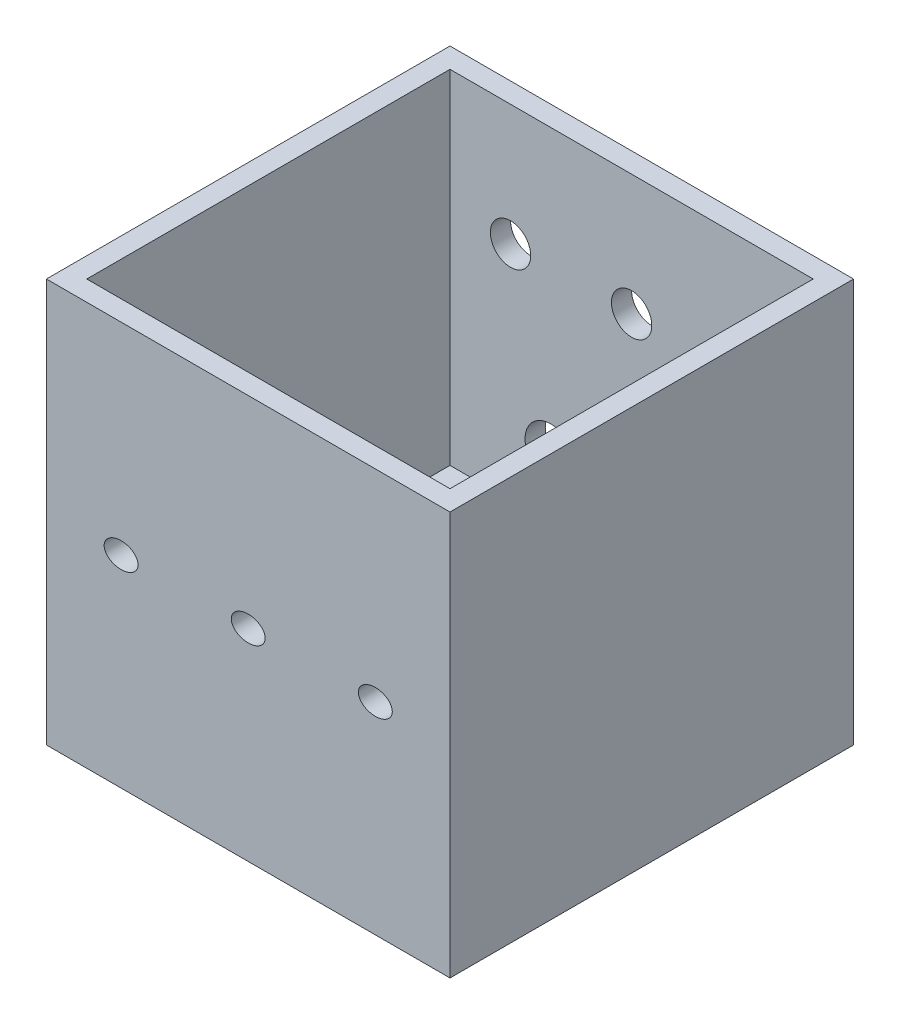
ISO-10303-21;
HEADER;
FILE_DESCRIPTION(('STEP AP214'),'2;1');
FILE_NAME('part.step','',(''),(''),'','','');
FILE_SCHEMA(('AUTOMOTIVE_DESIGN { 1 0 10303 214 1 1 1 1 }'));
ENDSEC;
DATA;
#1=APPLICATION_CONTEXT('core data for automotive mechanical design processes');
#2=APPLICATION_PROTOCOL_DEFINITION('international standard','automotive_design',2000,#1);
#3=PRODUCT_CONTEXT('',#1,'mechanical');
#4=PRODUCT('Part','Part','',(#3));
#5=PRODUCT_RELATED_PRODUCT_CATEGORY('part','',(#4));
#6=PRODUCT_DEFINITION_FORMATION('','',#4);
#7=PRODUCT_DEFINITION_CONTEXT('part definition',#1,'design');
#8=PRODUCT_DEFINITION('design','',#6,#7);
#9=PRODUCT_DEFINITION_SHAPE('','',#8);
#10=(LENGTH_UNIT() NAMED_UNIT(*) SI_UNIT(.MILLI.,.METRE.));
#11=(NAMED_UNIT(*) PLANE_ANGLE_UNIT() SI_UNIT($,.RADIAN.));
#12=(NAMED_UNIT(*) SI_UNIT($,.STERADIAN.) SOLID_ANGLE_UNIT());
#13=UNCERTAINTY_MEASURE_WITH_UNIT(LENGTH_MEASURE(1.E-05),#10,'distance_accuracy_value','');
#14=(GEOMETRIC_REPRESENTATION_CONTEXT(3) GLOBAL_UNCERTAINTY_ASSIGNED_CONTEXT((#13)) GLOBAL_UNIT_ASSIGNED_CONTEXT((#10,
#11,#12)) REPRESENTATION_CONTEXT('',''));
#15=CARTESIAN_POINT('',(0.,0.,0.));
#16=DIRECTION('',(0.,0.,1.));
#17=DIRECTION('',(1.,0.,0.));
#18=AXIS2_PLACEMENT_3D('',#15,#16,#17);
#19=CARTESIAN_POINT('',(31.75,-31.75,63.5));
#20=DIRECTION('',(-1.,0.,0.));
#21=DIRECTION('',(0.,0.,1.));
#22=AXIS2_PLACEMENT_3D('',#19,#20,#21);
#23=PLANE('',#22);
#24=DIRECTION('',(0.,1.,0.));
#25=VECTOR('',#24,1.);
#26=CARTESIAN_POINT('',(31.75,-31.75,0.));
#27=LINE('',#26,#25);
#28=CARTESIAN_POINT('',(31.75,-31.75,0.));
#29=VERTEX_POINT('',#28);
#30=CARTESIAN_POINT('',(31.75,31.75,0.));
#31=VERTEX_POINT('',#30);
#32=EDGE_CURVE('E186',#29,#31,#27,.T.);
#33=ORIENTED_EDGE('',*,*,#32,.T.);
#34=DIRECTION('',(0.,0.,-1.));
#35=VECTOR('',#34,1.);
#36=CARTESIAN_POINT('',(31.75,31.75,63.5));
#37=LINE('',#36,#35);
#38=CARTESIAN_POINT('',(31.75,31.75,63.5));
#39=VERTEX_POINT('',#38);
#40=EDGE_CURVE('E11',#39,#31,#37,.T.);
#41=ORIENTED_EDGE('',*,*,#40,.F.);
#42=DIRECTION('',(0.,1.,0.));
#43=VECTOR('',#42,1.);
#44=CARTESIAN_POINT('',(31.75,-31.75,63.5));
#45=LINE('',#44,#43);
#46=CARTESIAN_POINT('',(31.75,-31.75,63.5));
#47=VERTEX_POINT('',#46);
#48=EDGE_CURVE('E187',#47,#39,#45,.T.);
#49=ORIENTED_EDGE('',*,*,#48,.F.);
#50=DIRECTION('',(0.,0.,-1.));
#51=VECTOR('',#50,1.);
#52=CARTESIAN_POINT('',(31.75,-31.75,63.5));
#53=LINE('',#52,#51);
#54=EDGE_CURVE('E193',#47,#29,#53,.T.);
#55=ORIENTED_EDGE('',*,*,#54,.T.);
#56=EDGE_LOOP('',(#33,#41,#49,#55));
#57=FACE_BOUND('',#56,.T.);
#58=ADVANCED_FACE('F35',(#57),#23,.F.);
#59=CARTESIAN_POINT('',(-31.75,31.75,63.5));
#60=DIRECTION('',(0.,-1.,0.));
#61=DIRECTION('',(0.,0.,-1.));
#62=AXIS2_PLACEMENT_3D('',#59,#60,#61);
#63=PLANE('',#62);
#64=DIRECTION('',(-1.,0.,0.));
#65=VECTOR('',#64,1.);
#66=CARTESIAN_POINT('',(-28.575,31.75,3.175));
#67=LINE('',#66,#65);
#68=CARTESIAN_POINT('',(28.575,31.75,3.175));
#69=VERTEX_POINT('',#68);
#70=CARTESIAN_POINT('',(-28.575,31.75,3.175));
#71=VERTEX_POINT('',#70);
#72=EDGE_CURVE('E140',#69,#71,#67,.T.);
#73=ORIENTED_EDGE('',*,*,#72,.F.);
#74=DIRECTION('',(0.,0.,-1.));
#75=VECTOR('',#74,1.);
#76=CARTESIAN_POINT('',(28.575,31.75,60.325));
#77=LINE('',#76,#75);
#78=CARTESIAN_POINT('',(28.575,31.75,60.325));
#79=VERTEX_POINT('',#78);
#80=EDGE_CURVE('E49',#79,#69,#77,.T.);
#81=ORIENTED_EDGE('',*,*,#80,.F.);
#82=DIRECTION('',(1.,0.,0.));
#83=VECTOR('',#82,1.);
#84=CARTESIAN_POINT('',(-28.575,31.75,60.325));
#85=LINE('',#84,#83);
#86=CARTESIAN_POINT('',(-28.575,31.75,60.325));
#87=VERTEX_POINT('',#86);
#88=EDGE_CURVE('E128',#87,#79,#85,.T.);
#89=ORIENTED_EDGE('',*,*,#88,.F.);
#90=DIRECTION('',(0.,0.,1.));
#91=VECTOR('',#90,1.);
#92=CARTESIAN_POINT('',(-28.575,31.75,60.325));
#93=LINE('',#92,#91);
#94=EDGE_CURVE('E131',#71,#87,#93,.T.);
#95=ORIENTED_EDGE('',*,*,#94,.F.);
#96=EDGE_LOOP('',(#73,#81,#89,#95));
#97=FACE_BOUND('',#96,.T.);
#98=DIRECTION('',(-1.,0.,0.));
#99=VECTOR('',#98,1.);
#100=CARTESIAN_POINT('',(-31.75,31.75,0.));
#101=LINE('',#100,#99);
#102=CARTESIAN_POINT('',(-31.75,31.75,0.));
#103=VERTEX_POINT('',#102);
#104=EDGE_CURVE('E196',#31,#103,#101,.T.);
#105=ORIENTED_EDGE('',*,*,#104,.T.);
#106=DIRECTION('',(0.,0.,-1.));
#107=VECTOR('',#106,1.);
#108=CARTESIAN_POINT('',(-31.75,31.75,63.5));
#109=LINE('',#108,#107);
#110=CARTESIAN_POINT('',(-31.75,31.75,63.5));
#111=VERTEX_POINT('',#110);
#112=EDGE_CURVE('E42',#111,#103,#109,.T.);
#113=ORIENTED_EDGE('',*,*,#112,.F.);
#114=DIRECTION('',(-1.,0.,0.));
#115=VECTOR('',#114,1.);
#116=CARTESIAN_POINT('',(-31.75,31.75,63.5));
#117=LINE('',#116,#115);
#118=EDGE_CURVE('E86',#39,#111,#117,.T.);
#119=ORIENTED_EDGE('',*,*,#118,.F.);
#120=ORIENTED_EDGE('',*,*,#40,.T.);
#121=EDGE_LOOP('',(#105,#113,#119,#120));
#122=FACE_BOUND('',#121,.T.);
#123=ADVANCED_FACE('F224',(#97,#122),#63,.F.);
#124=CARTESIAN_POINT('',(-31.75,-31.75,63.5));
#125=DIRECTION('',(1.,0.,0.));
#126=DIRECTION('',(0.,0.,-1.));
#127=AXIS2_PLACEMENT_3D('',#124,#125,#126);
#128=PLANE('',#127);
#129=DIRECTION('',(0.,-1.,0.));
#130=VECTOR('',#129,1.);
#131=CARTESIAN_POINT('',(-31.75,-31.75,0.));
#132=LINE('',#131,#130);
#133=CARTESIAN_POINT('',(-31.75,-31.75,0.));
#134=VERTEX_POINT('',#133);
#135=EDGE_CURVE('E198',#103,#134,#132,.T.);
#136=ORIENTED_EDGE('',*,*,#135,.T.);
#137=DIRECTION('',(0.,0.,-1.));
#138=VECTOR('',#137,1.);
#139=CARTESIAN_POINT('',(-31.75,-31.75,63.5));
#140=LINE('',#139,#138);
#141=CARTESIAN_POINT('',(-31.75,-31.75,63.5));
#142=VERTEX_POINT('',#141);
#143=EDGE_CURVE('E202',#142,#134,#140,.T.);
#144=ORIENTED_EDGE('',*,*,#143,.F.);
#145=DIRECTION('',(0.,-1.,0.));
#146=VECTOR('',#145,1.);
#147=CARTESIAN_POINT('',(-31.75,-31.75,63.5));
#148=LINE('',#147,#146);
#149=EDGE_CURVE('E190',#111,#142,#148,.T.);
#150=ORIENTED_EDGE('',*,*,#149,.F.);
#151=ORIENTED_EDGE('',*,*,#112,.T.);
#152=EDGE_LOOP('',(#136,#144,#150,#151));
#153=FACE_BOUND('',#152,.T.);
#154=ADVANCED_FACE('F207',(#153),#128,.F.);
#155=CARTESIAN_POINT('',(-31.75,-31.75,63.5));
#156=DIRECTION('',(0.,1.,0.));
#157=DIRECTION('',(0.,0.,1.));
#158=AXIS2_PLACEMENT_3D('',#155,#156,#157);
#159=PLANE('',#158);
#160=DIRECTION('',(1.,0.,0.));
#161=VECTOR('',#160,1.);
#162=CARTESIAN_POINT('',(-31.75,-31.75,0.));
#163=LINE('',#162,#161);
#164=EDGE_CURVE('E79',#134,#29,#163,.T.);
#165=ORIENTED_EDGE('',*,*,#164,.T.);
#166=ORIENTED_EDGE('',*,*,#54,.F.);
#167=DIRECTION('',(1.,0.,0.));
#168=VECTOR('',#167,1.);
#169=CARTESIAN_POINT('',(-31.75,-31.75,63.5));
#170=LINE('',#169,#168);
#171=EDGE_CURVE('E58',#142,#47,#170,.T.);
#172=ORIENTED_EDGE('',*,*,#171,.F.);
#173=ORIENTED_EDGE('',*,*,#143,.T.);
#174=EDGE_LOOP('',(#165,#166,#172,#173));
#175=FACE_BOUND('',#174,.T.);
#176=ADVANCED_FACE('F215',(#175),#159,.F.);
#177=CARTESIAN_POINT('',(0.,0.,63.5));
#178=DIRECTION('',(0.,0.,-1.));
#179=DIRECTION('',(-1.,0.,0.));
#180=AXIS2_PLACEMENT_3D('',#177,#178,#179);
#181=PLANE('',#180);
#182=CARTESIAN_POINT('',(-20.,0.,63.5));
#183=DIRECTION('',(0.,0.,1.));
#184=DIRECTION('',(1.,0.,0.));
#185=AXIS2_PLACEMENT_3D('',#182,#183,#184);
#186=ELLIPSE('',#185,2.667,1.9685);
#187=CARTESIAN_POINT('',(-17.333,0.,63.5));
#188=VERTEX_POINT('',#187);
#189=EDGE_CURVE('E158',#188,#188,#186,.T.);
#190=ORIENTED_EDGE('',*,*,#189,.F.);
#191=EDGE_LOOP('',(#190));
#192=FACE_BOUND('',#191,.T.);
#193=CARTESIAN_POINT('',(20.,0.,63.5));
#194=DIRECTION('',(0.,0.,1.));
#195=DIRECTION('',(1.,0.,0.));
#196=AXIS2_PLACEMENT_3D('',#193,#194,#195);
#197=ELLIPSE('',#196,2.667,1.9685);
#198=CARTESIAN_POINT('',(22.667,0.,63.5));
#199=VERTEX_POINT('',#198);
#200=EDGE_CURVE('E179',#199,#199,#197,.T.);
#201=ORIENTED_EDGE('',*,*,#200,.F.);
#202=EDGE_LOOP('',(#201));
#203=FACE_BOUND('',#202,.T.);
#204=CARTESIAN_POINT('',(0.,0.,63.5));
#205=DIRECTION('',(0.,0.,1.));
#206=DIRECTION('',(1.,0.,0.));
#207=AXIS2_PLACEMENT_3D('',#204,#205,#206);
#208=ELLIPSE('',#207,2.667,1.9685);
#209=CARTESIAN_POINT('',(2.667,0.,63.5));
#210=VERTEX_POINT('',#209);
#211=EDGE_CURVE('E181',#210,#210,#208,.T.);
#212=ORIENTED_EDGE('',*,*,#211,.F.);
#213=EDGE_LOOP('',(#212));
#214=FACE_BOUND('',#213,.T.);
#215=ORIENTED_EDGE('',*,*,#48,.T.);
#216=ORIENTED_EDGE('',*,*,#118,.T.);
#217=ORIENTED_EDGE('',*,*,#149,.T.);
#218=ORIENTED_EDGE('',*,*,#171,.T.);
#219=EDGE_LOOP('',(#215,#216,#217,#218));
#220=FACE_BOUND('',#219,.T.);
#221=ADVANCED_FACE('F217',(#192,#203,#214,#220),#181,.F.);
#222=CARTESIAN_POINT('',(0.,0.,0.));
#223=DIRECTION('',(0.,0.,-1.));
#224=DIRECTION('',(-1.,0.,0.));
#225=AXIS2_PLACEMENT_3D('',#222,#223,#224);
#226=PLANE('',#225);
#227=CARTESIAN_POINT('',(-19.05,12.7,0.));
#228=DIRECTION('',(0.,0.,-1.));
#229=DIRECTION('',(-1.,0.,0.));
#230=AXIS2_PLACEMENT_3D('',#227,#228,#229);
#231=CIRCLE('',#230,3.175);
#232=CARTESIAN_POINT('',(-22.225,12.7,0.));
#233=VERTEX_POINT('',#232);
#234=EDGE_CURVE('E260',#233,#233,#231,.T.);
#235=ORIENTED_EDGE('',*,*,#234,.F.);
#236=EDGE_LOOP('',(#235));
#237=FACE_BOUND('',#236,.T.);
#238=CARTESIAN_POINT('',(0.,12.7,0.));
#239=DIRECTION('',(0.,0.,-1.));
#240=DIRECTION('',(-1.,0.,0.));
#241=AXIS2_PLACEMENT_3D('',#238,#239,#240);
#242=CIRCLE('',#241,3.175);
#243=CARTESIAN_POINT('',(-3.175,12.7,0.));
#244=VERTEX_POINT('',#243);
#245=EDGE_CURVE('E264',#244,#244,#242,.T.);
#246=ORIENTED_EDGE('',*,*,#245,.F.);
#247=EDGE_LOOP('',(#246));
#248=FACE_BOUND('',#247,.T.);
#249=CARTESIAN_POINT('',(19.05,12.7,0.));
#250=DIRECTION('',(0.,0.,-1.));
#251=DIRECTION('',(-1.,0.,0.));
#252=AXIS2_PLACEMENT_3D('',#249,#250,#251);
#253=CIRCLE('',#252,3.175);
#254=CARTESIAN_POINT('',(15.875,12.7,0.));
#255=VERTEX_POINT('',#254);
#256=EDGE_CURVE('E268',#255,#255,#253,.T.);
#257=ORIENTED_EDGE('',*,*,#256,.F.);
#258=EDGE_LOOP('',(#257));
#259=FACE_BOUND('',#258,.T.);
#260=CARTESIAN_POINT('',(-12.7,-12.7,0.));
#261=DIRECTION('',(0.,0.,-1.));
#262=DIRECTION('',(-1.,0.,0.));
#263=AXIS2_PLACEMENT_3D('',#260,#261,#262);
#264=CIRCLE('',#263,4.064);
#265=CARTESIAN_POINT('',(-16.764,-12.7,0.));
#266=VERTEX_POINT('',#265);
#267=EDGE_CURVE('E272',#266,#266,#264,.T.);
#268=ORIENTED_EDGE('',*,*,#267,.F.);
#269=EDGE_LOOP('',(#268));
#270=FACE_BOUND('',#269,.T.);
#271=CARTESIAN_POINT('',(12.5984,-12.7,0.));
#272=DIRECTION('',(0.,0.,-1.));
#273=DIRECTION('',(-1.,0.,0.));
#274=AXIS2_PLACEMENT_3D('',#271,#272,#273);
#275=CIRCLE('',#274,4.064);
#276=CARTESIAN_POINT('',(8.5344,-12.7,0.));
#277=VERTEX_POINT('',#276);
#278=EDGE_CURVE('E134',#277,#277,#275,.T.);
#279=ORIENTED_EDGE('',*,*,#278,.F.);
#280=EDGE_LOOP('',(#279));
#281=FACE_BOUND('',#280,.T.);
#282=ORIENTED_EDGE('',*,*,#32,.F.);
#283=ORIENTED_EDGE('',*,*,#164,.F.);
#284=ORIENTED_EDGE('',*,*,#135,.F.);
#285=ORIENTED_EDGE('',*,*,#104,.F.);
#286=EDGE_LOOP('',(#282,#283,#284,#285));
#287=FACE_BOUND('',#286,.T.);
#288=ADVANCED_FACE('F211',(#237,#248,#259,#270,#281,#287),#226,.T.);
#289=CARTESIAN_POINT('',(0.,0.,60.325));
#290=DIRECTION('',(0.,0.,1.));
#291=DIRECTION('',(1.,0.,0.));
#292=AXIS2_PLACEMENT_3D('',#289,#290,#291);
#293=ELLIPSE('',#292,2.667,1.9685);
#294=DIRECTION('',(0.,0.,1.));
#295=VECTOR('',#294,1.);
#296=SURFACE_OF_LINEAR_EXTRUSION('',#293,#295);
#297=CARTESIAN_POINT('',(0.,0.,60.325));
#298=DIRECTION('',(0.,0.,1.));
#299=DIRECTION('',(1.,0.,0.));
#300=AXIS2_PLACEMENT_3D('',#297,#298,#299);
#301=ELLIPSE('',#300,2.667,1.9685);
#302=CARTESIAN_POINT('',(2.667,0.,60.325));
#303=VERTEX_POINT('',#302);
#304=EDGE_CURVE('E155',#303,#303,#301,.F.);
#305=ORIENTED_EDGE('',*,*,#304,.T.);
#306=EDGE_LOOP('',(#305));
#307=FACE_BOUND('',#306,.T.);
#308=ORIENTED_EDGE('',*,*,#211,.T.);
#309=EDGE_LOOP('',(#308));
#310=FACE_BOUND('',#309,.T.);
#311=ADVANCED_FACE('F173',(#307,#310),#296,.F.);
#312=CARTESIAN_POINT('',(20.,0.,60.325));
#313=DIRECTION('',(0.,0.,1.));
#314=DIRECTION('',(1.,0.,0.));
#315=AXIS2_PLACEMENT_3D('',#312,#313,#314);
#316=ELLIPSE('',#315,2.667,1.9685);
#317=DIRECTION('',(0.,0.,1.));
#318=VECTOR('',#317,1.);
#319=SURFACE_OF_LINEAR_EXTRUSION('',#316,#318);
#320=CARTESIAN_POINT('',(20.,0.,60.325));
#321=DIRECTION('',(0.,0.,1.));
#322=DIRECTION('',(1.,0.,0.));
#323=AXIS2_PLACEMENT_3D('',#320,#321,#322);
#324=ELLIPSE('',#323,2.667,1.9685);
#325=CARTESIAN_POINT('',(22.667,0.,60.325));
#326=VERTEX_POINT('',#325);
#327=EDGE_CURVE('E152',#326,#326,#324,.F.);
#328=ORIENTED_EDGE('',*,*,#327,.T.);
#329=EDGE_LOOP('',(#328));
#330=FACE_BOUND('',#329,.T.);
#331=ORIENTED_EDGE('',*,*,#200,.T.);
#332=EDGE_LOOP('',(#331));
#333=FACE_BOUND('',#332,.T.);
#334=ADVANCED_FACE('F168',(#330,#333),#319,.F.);
#335=CARTESIAN_POINT('',(-20.,0.,60.325));
#336=DIRECTION('',(0.,0.,1.));
#337=DIRECTION('',(1.,0.,0.));
#338=AXIS2_PLACEMENT_3D('',#335,#336,#337);
#339=ELLIPSE('',#338,2.667,1.9685);
#340=DIRECTION('',(0.,0.,1.));
#341=VECTOR('',#340,1.);
#342=SURFACE_OF_LINEAR_EXTRUSION('',#339,#341);
#343=CARTESIAN_POINT('',(-20.,0.,60.325));
#344=DIRECTION('',(0.,0.,1.));
#345=DIRECTION('',(1.,0.,0.));
#346=AXIS2_PLACEMENT_3D('',#343,#344,#345);
#347=ELLIPSE('',#346,2.667,1.9685);
#348=CARTESIAN_POINT('',(-17.333,0.,60.325));
#349=VERTEX_POINT('',#348);
#350=EDGE_CURVE('E146',#349,#349,#347,.F.);
#351=ORIENTED_EDGE('',*,*,#350,.T.);
#352=EDGE_LOOP('',(#351));
#353=FACE_BOUND('',#352,.T.);
#354=ORIENTED_EDGE('',*,*,#189,.T.);
#355=EDGE_LOOP('',(#354));
#356=FACE_BOUND('',#355,.T.);
#357=ADVANCED_FACE('F163',(#353,#356),#342,.F.);
#358=CARTESIAN_POINT('',(-28.575,-22.225,60.325));
#359=DIRECTION('',(0.,0.,1.));
#360=DIRECTION('',(1.,0.,0.));
#361=AXIS2_PLACEMENT_3D('',#358,#359,#360);
#362=PLANE('',#361);
#363=ORIENTED_EDGE('',*,*,#327,.F.);
#364=EDGE_LOOP('',(#363));
#365=FACE_BOUND('',#364,.T.);
#366=ORIENTED_EDGE('',*,*,#88,.T.);
#367=DIRECTION('',(0.,1.,0.));
#368=VECTOR('',#367,1.);
#369=CARTESIAN_POINT('',(28.575,-22.225,60.325));
#370=LINE('',#369,#368);
#371=CARTESIAN_POINT('',(28.575,-22.225,60.325));
#372=VERTEX_POINT('',#371);
#373=EDGE_CURVE('E144',#372,#79,#370,.T.);
#374=ORIENTED_EDGE('',*,*,#373,.F.);
#375=DIRECTION('',(1.,0.,0.));
#376=VECTOR('',#375,1.);
#377=CARTESIAN_POINT('',(-28.575,-22.225,60.325));
#378=LINE('',#377,#376);
#379=CARTESIAN_POINT('',(-28.575,-22.225,60.325));
#380=VERTEX_POINT('',#379);
#381=EDGE_CURVE('E116',#380,#372,#378,.T.);
#382=ORIENTED_EDGE('',*,*,#381,.F.);
#383=DIRECTION('',(0.,1.,0.));
#384=VECTOR('',#383,1.);
#385=CARTESIAN_POINT('',(-28.575,-22.225,60.325));
#386=LINE('',#385,#384);
#387=EDGE_CURVE('E147',#380,#87,#386,.T.);
#388=ORIENTED_EDGE('',*,*,#387,.T.);
#389=EDGE_LOOP('',(#366,#374,#382,#388));
#390=FACE_BOUND('',#389,.T.);
#391=ORIENTED_EDGE('',*,*,#350,.F.);
#392=EDGE_LOOP('',(#391));
#393=FACE_BOUND('',#392,.T.);
#394=ORIENTED_EDGE('',*,*,#304,.F.);
#395=EDGE_LOOP('',(#394));
#396=FACE_BOUND('',#395,.T.);
#397=ADVANCED_FACE('F167',(#365,#390,#393,#396),#362,.F.);
#398=CARTESIAN_POINT('',(28.575,-22.225,60.325));
#399=DIRECTION('',(1.,0.,0.));
#400=DIRECTION('',(0.,0.,-1.));
#401=AXIS2_PLACEMENT_3D('',#398,#399,#400);
#402=PLANE('',#401);
#403=ORIENTED_EDGE('',*,*,#80,.T.);
#404=DIRECTION('',(0.,1.,0.));
#405=VECTOR('',#404,1.);
#406=CARTESIAN_POINT('',(28.575,-22.225,3.175));
#407=LINE('',#406,#405);
#408=CARTESIAN_POINT('',(28.575,-22.225,3.175));
#409=VERTEX_POINT('',#408);
#410=EDGE_CURVE('E106',#409,#69,#407,.T.);
#411=ORIENTED_EDGE('',*,*,#410,.F.);
#412=DIRECTION('',(0.,0.,-1.));
#413=VECTOR('',#412,1.);
#414=CARTESIAN_POINT('',(28.575,-22.225,60.325));
#415=LINE('',#414,#413);
#416=EDGE_CURVE('E110',#372,#409,#415,.T.);
#417=ORIENTED_EDGE('',*,*,#416,.F.);
#418=ORIENTED_EDGE('',*,*,#373,.T.);
#419=EDGE_LOOP('',(#403,#411,#417,#418));
#420=FACE_BOUND('',#419,.T.);
#421=ADVANCED_FACE('F108',(#420),#402,.F.);
#422=CARTESIAN_POINT('',(-28.575,-22.225,60.325));
#423=DIRECTION('',(-1.,0.,0.));
#424=DIRECTION('',(0.,0.,1.));
#425=AXIS2_PLACEMENT_3D('',#422,#423,#424);
#426=PLANE('',#425);
#427=ORIENTED_EDGE('',*,*,#94,.T.);
#428=ORIENTED_EDGE('',*,*,#387,.F.);
#429=DIRECTION('',(0.,0.,1.));
#430=VECTOR('',#429,1.);
#431=CARTESIAN_POINT('',(-28.575,-22.225,60.325));
#432=LINE('',#431,#430);
#433=CARTESIAN_POINT('',(-28.575,-22.225,3.175));
#434=VERTEX_POINT('',#433);
#435=EDGE_CURVE('E124',#434,#380,#432,.T.);
#436=ORIENTED_EDGE('',*,*,#435,.F.);
#437=DIRECTION('',(0.,1.,0.));
#438=VECTOR('',#437,1.);
#439=CARTESIAN_POINT('',(-28.575,-22.225,3.175));
#440=LINE('',#439,#438);
#441=EDGE_CURVE('E115',#434,#71,#440,.T.);
#442=ORIENTED_EDGE('',*,*,#441,.T.);
#443=EDGE_LOOP('',(#427,#428,#436,#442));
#444=FACE_BOUND('',#443,.T.);
#445=ADVANCED_FACE('F237',(#444),#426,.F.);
#446=CARTESIAN_POINT('',(-28.575,-22.225,3.175));
#447=DIRECTION('',(0.,0.,-1.));
#448=DIRECTION('',(-1.,0.,0.));
#449=AXIS2_PLACEMENT_3D('',#446,#447,#448);
#450=PLANE('',#449);
#451=CARTESIAN_POINT('',(-19.05,12.7,3.175));
#452=DIRECTION('',(0.,0.,-1.));
#453=DIRECTION('',(-1.,0.,0.));
#454=AXIS2_PLACEMENT_3D('',#451,#452,#453);
#455=CIRCLE('',#454,3.175);
#456=CARTESIAN_POINT('',(-22.225,12.7,3.175));
#457=VERTEX_POINT('',#456);
#458=EDGE_CURVE('E294',#457,#457,#455,.F.);
#459=ORIENTED_EDGE('',*,*,#458,.F.);
#460=EDGE_LOOP('',(#459));
#461=FACE_BOUND('',#460,.T.);
#462=CARTESIAN_POINT('',(0.,12.7,3.175));
#463=DIRECTION('',(0.,0.,-1.));
#464=DIRECTION('',(-1.,0.,0.));
#465=AXIS2_PLACEMENT_3D('',#462,#463,#464);
#466=CIRCLE('',#465,3.175);
#467=CARTESIAN_POINT('',(-3.175,12.7,3.175));
#468=VERTEX_POINT('',#467);
#469=EDGE_CURVE('E290',#468,#468,#466,.F.);
#470=ORIENTED_EDGE('',*,*,#469,.F.);
#471=EDGE_LOOP('',(#470));
#472=FACE_BOUND('',#471,.T.);
#473=CARTESIAN_POINT('',(19.05,12.7,3.175));
#474=DIRECTION('',(0.,0.,-1.));
#475=DIRECTION('',(-1.,0.,0.));
#476=AXIS2_PLACEMENT_3D('',#473,#474,#475);
#477=CIRCLE('',#476,3.175);
#478=CARTESIAN_POINT('',(15.875,12.7,3.175));
#479=VERTEX_POINT('',#478);
#480=EDGE_CURVE('E286',#479,#479,#477,.F.);
#481=ORIENTED_EDGE('',*,*,#480,.F.);
#482=EDGE_LOOP('',(#481));
#483=FACE_BOUND('',#482,.T.);
#484=CARTESIAN_POINT('',(-12.7,-12.7,3.175));
#485=DIRECTION('',(0.,0.,-1.));
#486=DIRECTION('',(-1.,0.,0.));
#487=AXIS2_PLACEMENT_3D('',#484,#485,#486);
#488=CIRCLE('',#487,4.064);
#489=CARTESIAN_POINT('',(-16.764,-12.7,3.175));
#490=VERTEX_POINT('',#489);
#491=EDGE_CURVE('E280',#490,#490,#488,.F.);
#492=ORIENTED_EDGE('',*,*,#491,.F.);
#493=EDGE_LOOP('',(#492));
#494=FACE_BOUND('',#493,.T.);
#495=CARTESIAN_POINT('',(12.5984,-12.7,3.175));
#496=DIRECTION('',(0.,0.,-1.));
#497=DIRECTION('',(-1.,0.,0.));
#498=AXIS2_PLACEMENT_3D('',#495,#496,#497);
#499=CIRCLE('',#498,4.064);
#500=CARTESIAN_POINT('',(8.5344,-12.7,3.175));
#501=VERTEX_POINT('',#500);
#502=EDGE_CURVE('E276',#501,#501,#499,.F.);
#503=ORIENTED_EDGE('',*,*,#502,.F.);
#504=EDGE_LOOP('',(#503));
#505=FACE_BOUND('',#504,.T.);
#506=ORIENTED_EDGE('',*,*,#72,.T.);
#507=ORIENTED_EDGE('',*,*,#441,.F.);
#508=DIRECTION('',(-1.,0.,0.));
#509=VECTOR('',#508,1.);
#510=CARTESIAN_POINT('',(-28.575,-22.225,3.175));
#511=LINE('',#510,#509);
#512=EDGE_CURVE('E119',#409,#434,#511,.T.);
#513=ORIENTED_EDGE('',*,*,#512,.F.);
#514=ORIENTED_EDGE('',*,*,#410,.T.);
#515=EDGE_LOOP('',(#506,#507,#513,#514));
#516=FACE_BOUND('',#515,.T.);
#517=ADVANCED_FACE('F120',(#461,#472,#483,#494,#505,#516),#450,.F.);
#518=CARTESIAN_POINT('',(0.,-22.225,0.));
#519=DIRECTION('',(0.,-1.,0.));
#520=DIRECTION('',(0.,0.,-1.));
#521=AXIS2_PLACEMENT_3D('',#518,#519,#520);
#522=PLANE('',#521);
#523=ORIENTED_EDGE('',*,*,#416,.T.);
#524=ORIENTED_EDGE('',*,*,#512,.T.);
#525=ORIENTED_EDGE('',*,*,#435,.T.);
#526=ORIENTED_EDGE('',*,*,#381,.T.);
#527=EDGE_LOOP('',(#523,#524,#525,#526));
#528=FACE_BOUND('',#527,.T.);
#529=ADVANCED_FACE('F126',(#528),#522,.F.);
#530=CARTESIAN_POINT('',(12.5984,-12.7,63.501));
#531=DIRECTION('',(0.,0.,-1.));
#532=DIRECTION('',(-1.,0.,0.));
#533=AXIS2_PLACEMENT_3D('',#530,#531,#532);
#534=CYLINDRICAL_SURFACE('',#533,4.064);
#535=ORIENTED_EDGE('',*,*,#278,.T.);
#536=EDGE_LOOP('',(#535));
#537=FACE_BOUND('',#536,.T.);
#538=ORIENTED_EDGE('',*,*,#502,.T.);
#539=EDGE_LOOP('',(#538));
#540=FACE_BOUND('',#539,.T.);
#541=ADVANCED_FACE('F312',(#537,#540),#534,.F.);
#542=CARTESIAN_POINT('',(-12.7,-12.7,63.501));
#543=DIRECTION('',(0.,0.,-1.));
#544=DIRECTION('',(-1.,0.,0.));
#545=AXIS2_PLACEMENT_3D('',#542,#543,#544);
#546=CYLINDRICAL_SURFACE('',#545,4.064);
#547=ORIENTED_EDGE('',*,*,#267,.T.);
#548=EDGE_LOOP('',(#547));
#549=FACE_BOUND('',#548,.T.);
#550=ORIENTED_EDGE('',*,*,#491,.T.);
#551=EDGE_LOOP('',(#550));
#552=FACE_BOUND('',#551,.T.);
#553=ADVANCED_FACE('F309',(#549,#552),#546,.F.);
#554=CARTESIAN_POINT('',(19.05,12.7,63.501));
#555=DIRECTION('',(0.,0.,-1.));
#556=DIRECTION('',(-1.,0.,0.));
#557=AXIS2_PLACEMENT_3D('',#554,#555,#556);
#558=CYLINDRICAL_SURFACE('',#557,3.175);
#559=ORIENTED_EDGE('',*,*,#256,.T.);
#560=EDGE_LOOP('',(#559));
#561=FACE_BOUND('',#560,.T.);
#562=ORIENTED_EDGE('',*,*,#480,.T.);
#563=EDGE_LOOP('',(#562));
#564=FACE_BOUND('',#563,.T.);
#565=ADVANCED_FACE('F311',(#561,#564),#558,.F.);
#566=CARTESIAN_POINT('',(0.,12.7,63.501));
#567=DIRECTION('',(0.,0.,-1.));
#568=DIRECTION('',(-1.,0.,0.));
#569=AXIS2_PLACEMENT_3D('',#566,#567,#568);
#570=CYLINDRICAL_SURFACE('',#569,3.175);
#571=ORIENTED_EDGE('',*,*,#245,.T.);
#572=EDGE_LOOP('',(#571));
#573=FACE_BOUND('',#572,.T.);
#574=ORIENTED_EDGE('',*,*,#469,.T.);
#575=EDGE_LOOP('',(#574));
#576=FACE_BOUND('',#575,.T.);
#577=ADVANCED_FACE('F319',(#573,#576),#570,.F.);
#578=CARTESIAN_POINT('',(-19.05,12.7,63.501));
#579=DIRECTION('',(0.,0.,-1.));
#580=DIRECTION('',(-1.,0.,0.));
#581=AXIS2_PLACEMENT_3D('',#578,#579,#580);
#582=CYLINDRICAL_SURFACE('',#581,3.175);
#583=ORIENTED_EDGE('',*,*,#234,.T.);
#584=EDGE_LOOP('',(#583));
#585=FACE_BOUND('',#584,.T.);
#586=ORIENTED_EDGE('',*,*,#458,.T.);
#587=EDGE_LOOP('',(#586));
#588=FACE_BOUND('',#587,.T.);
#589=ADVANCED_FACE('F298',(#585,#588),#582,.F.);
#590=CLOSED_SHELL('',(#58,#123,#154,#176,#221,#288,#311,#334,#357,#397,#421,#445,#517,#529,#541,
#553,#565,#577,#589));
#591=MANIFOLD_SOLID_BREP('B2',#590);
#592=ADVANCED_BREP_SHAPE_REPRESENTATION('',(#18,#591),#14);
#593=SHAPE_DEFINITION_REPRESENTATION(#9,#592);
ENDSEC;
END-ISO-10303-21;
